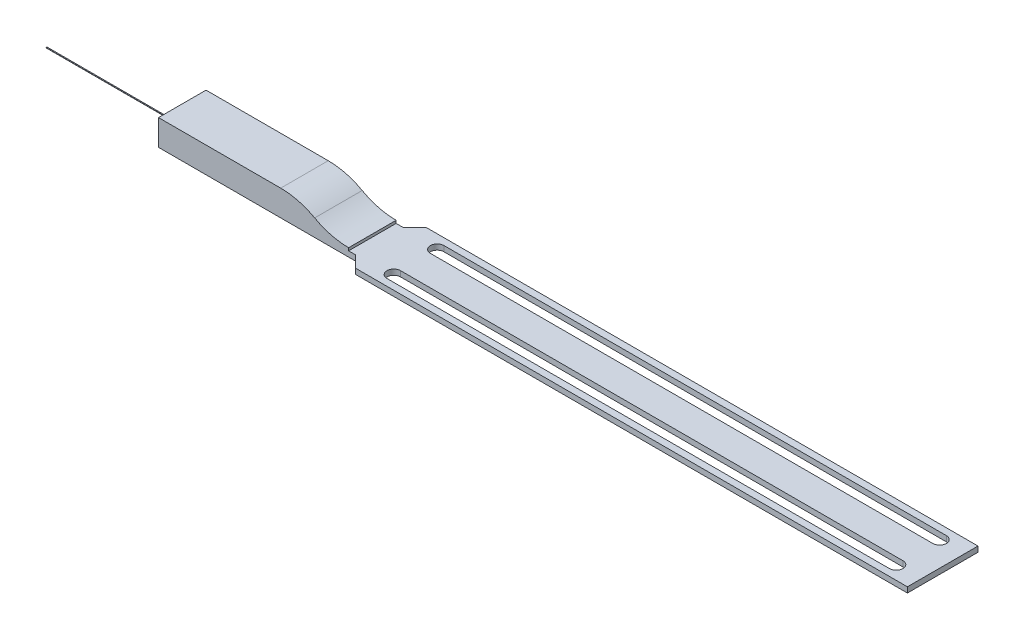
ISO-10303-21;
HEADER;
FILE_DESCRIPTION(('STEP AP214'),'2;1');
FILE_NAME('part.step','',(''),(''),'','','');
FILE_SCHEMA(('AUTOMOTIVE_DESIGN { 1 0 10303 214 1 1 1 1 }'));
ENDSEC;
DATA;
#1=APPLICATION_CONTEXT('core data for automotive mechanical design processes');
#2=APPLICATION_PROTOCOL_DEFINITION('international standard','automotive_design',2000,#1);
#3=PRODUCT_CONTEXT('',#1,'mechanical');
#4=PRODUCT('Part','Part','',(#3));
#5=PRODUCT_RELATED_PRODUCT_CATEGORY('part','',(#4));
#6=PRODUCT_DEFINITION_FORMATION('','',#4);
#7=PRODUCT_DEFINITION_CONTEXT('part definition',#1,'design');
#8=PRODUCT_DEFINITION('design','',#6,#7);
#9=PRODUCT_DEFINITION_SHAPE('','',#8);
#10=(LENGTH_UNIT() NAMED_UNIT(*) SI_UNIT(.MILLI.,.METRE.));
#11=(NAMED_UNIT(*) PLANE_ANGLE_UNIT() SI_UNIT($,.RADIAN.));
#12=(NAMED_UNIT(*) SI_UNIT($,.STERADIAN.) SOLID_ANGLE_UNIT());
#13=UNCERTAINTY_MEASURE_WITH_UNIT(LENGTH_MEASURE(1.E-05),#10,'distance_accuracy_value','');
#14=(GEOMETRIC_REPRESENTATION_CONTEXT(3) GLOBAL_UNCERTAINTY_ASSIGNED_CONTEXT((#13)) GLOBAL_UNIT_ASSIGNED_CONTEXT((#10,
#11,#12)) REPRESENTATION_CONTEXT('',''));
#15=CARTESIAN_POINT('',(0.,0.,0.));
#16=DIRECTION('',(0.,0.,1.));
#17=DIRECTION('',(1.,0.,0.));
#18=AXIS2_PLACEMENT_3D('',#15,#16,#17);
#19=CARTESIAN_POINT('',(-7.,1.9,1.75));
#20=DIRECTION('',(1.,0.,0.));
#21=DIRECTION('',(0.,0.,-1.));
#22=AXIS2_PLACEMENT_3D('',#19,#20,#21);
#23=PLANE('',#22);
#24=DIRECTION('',(0.,0.,1.));
#25=VECTOR('',#24,1.);
#26=CARTESIAN_POINT('',(-7.,0.,1.75));
#27=LINE('',#26,#25);
#28=CARTESIAN_POINT('',(-7.,0.,-1.75));
#29=VERTEX_POINT('',#28);
#30=CARTESIAN_POINT('',(-7.,0.,1.75));
#31=VERTEX_POINT('',#30);
#32=EDGE_CURVE('E366',#29,#31,#27,.T.);
#33=ORIENTED_EDGE('',*,*,#32,.T.);
#34=DIRECTION('',(0.,-1.,0.));
#35=VECTOR('',#34,1.);
#36=CARTESIAN_POINT('',(-7.,1.9,1.75));
#37=LINE('',#36,#35);
#38=CARTESIAN_POINT('',(-7.,1.9,1.75));
#39=VERTEX_POINT('',#38);
#40=EDGE_CURVE('E370',#39,#31,#37,.T.);
#41=ORIENTED_EDGE('',*,*,#40,.F.);
#42=DIRECTION('',(0.,0.,1.));
#43=VECTOR('',#42,1.);
#44=CARTESIAN_POINT('',(-7.,1.9,1.75));
#45=LINE('',#44,#43);
#46=CARTESIAN_POINT('',(-7.,1.9,-1.75));
#47=VERTEX_POINT('',#46);
#48=EDGE_CURVE('E358',#47,#39,#45,.T.);
#49=ORIENTED_EDGE('',*,*,#48,.F.);
#50=DIRECTION('',(0.,-1.,0.));
#51=VECTOR('',#50,1.);
#52=CARTESIAN_POINT('',(-7.,1.9,-1.75));
#53=LINE('',#52,#51);
#54=EDGE_CURVE('E373',#47,#29,#53,.T.);
#55=ORIENTED_EDGE('',*,*,#54,.T.);
#56=EDGE_LOOP('',(#33,#41,#49,#55));
#57=FACE_BOUND('',#56,.T.);
#58=DIRECTION('',(0.,1.,0.));
#59=VECTOR('',#58,1.);
#60=CARTESIAN_POINT('',(-7.,0.488,0.0349999999999996));
#61=LINE('',#60,#59);
#62=CARTESIAN_POINT('',(-7.,0.488,0.0349999999999996));
#63=VERTEX_POINT('',#62);
#64=CARTESIAN_POINT('',(-7.,0.512,0.0349999999999997));
#65=VERTEX_POINT('',#64);
#66=EDGE_CURVE('E217',#63,#65,#61,.T.);
#67=ORIENTED_EDGE('',*,*,#66,.F.);
#68=DIRECTION('',(0.,0.,1.));
#69=VECTOR('',#68,1.);
#70=CARTESIAN_POINT('',(-7.,0.488,-0.0350000000000004));
#71=LINE('',#70,#69);
#72=CARTESIAN_POINT('',(-7.,0.488,-0.0350000000000005));
#73=VERTEX_POINT('',#72);
#74=EDGE_CURVE('E214',#73,#63,#71,.T.);
#75=ORIENTED_EDGE('',*,*,#74,.F.);
#76=DIRECTION('',(0.,-1.,0.));
#77=VECTOR('',#76,1.);
#78=CARTESIAN_POINT('',(-7.,0.488,-0.0350000000000004));
#79=LINE('',#78,#77);
#80=CARTESIAN_POINT('',(-7.,0.512,-0.0350000000000004));
#81=VERTEX_POINT('',#80);
#82=EDGE_CURVE('E56',#81,#73,#79,.T.);
#83=ORIENTED_EDGE('',*,*,#82,.F.);
#84=DIRECTION('',(0.,0.,-1.));
#85=VECTOR('',#84,1.);
#86=CARTESIAN_POINT('',(-7.,0.512,-0.0350000000000004));
#87=LINE('',#86,#85);
#88=EDGE_CURVE('E51',#65,#81,#87,.T.);
#89=ORIENTED_EDGE('',*,*,#88,.F.);
#90=EDGE_LOOP('',(#67,#75,#83,#89));
#91=FACE_BOUND('',#90,.T.);
#92=ADVANCED_FACE('F36',(#57,#91),#23,.F.);
#93=CARTESIAN_POINT('',(7.,1.9,1.75));
#94=DIRECTION('',(-1.,0.,0.));
#95=DIRECTION('',(0.,0.,1.));
#96=AXIS2_PLACEMENT_3D('',#93,#94,#95);
#97=PLANE('',#96);
#98=DIRECTION('',(0.,-1.,0.));
#99=VECTOR('',#98,1.);
#100=CARTESIAN_POINT('',(7.,1.9,-1.75));
#101=LINE('',#100,#99);
#102=CARTESIAN_POINT('',(7.,0.6,-1.75));
#103=VERTEX_POINT('',#102);
#104=CARTESIAN_POINT('',(7.,0.4,-1.75));
#105=VERTEX_POINT('',#104);
#106=EDGE_CURVE('E376',#103,#105,#101,.T.);
#107=ORIENTED_EDGE('',*,*,#106,.F.);
#108=DIRECTION('',(0.,0.,1.));
#109=VECTOR('',#108,1.);
#110=CARTESIAN_POINT('',(7.,0.6,-2.6));
#111=LINE('',#110,#109);
#112=CARTESIAN_POINT('',(7.,0.6,1.75));
#113=VERTEX_POINT('',#112);
#114=EDGE_CURVE('E218',#103,#113,#111,.T.);
#115=ORIENTED_EDGE('',*,*,#114,.T.);
#116=DIRECTION('',(0.,-1.,0.));
#117=VECTOR('',#116,1.);
#118=CARTESIAN_POINT('',(7.,1.9,1.75));
#119=LINE('',#118,#117);
#120=CARTESIAN_POINT('',(7.,0.4,1.75));
#121=VERTEX_POINT('',#120);
#122=EDGE_CURVE('E364',#113,#121,#119,.T.);
#123=ORIENTED_EDGE('',*,*,#122,.T.);
#124=DIRECTION('',(0.,0.,-1.));
#125=VECTOR('',#124,1.);
#126=CARTESIAN_POINT('',(7.,0.4,1.75));
#127=LINE('',#126,#125);
#128=EDGE_CURVE('E303',#121,#105,#127,.T.);
#129=ORIENTED_EDGE('',*,*,#128,.T.);
#130=EDGE_LOOP('',(#107,#115,#123,#129));
#131=FACE_BOUND('',#130,.T.);
#132=ADVANCED_FACE('F38',(#131),#97,.F.);
#133=CARTESIAN_POINT('',(-7.,1.9,-1.75));
#134=DIRECTION('',(0.,0.,1.));
#135=DIRECTION('',(1.,0.,0.));
#136=AXIS2_PLACEMENT_3D('',#133,#134,#135);
#137=PLANE('',#136);
#138=CARTESIAN_POINT('',(2.,-3.23269230769231,-1.75));
#139=DIRECTION('',(0.,0.,1.));
#140=DIRECTION('',(1.,0.,0.));
#141=AXIS2_PLACEMENT_3D('',#138,#139,#140);
#142=CIRCLE('',#141,5.13269230769231);
#143=CARTESIAN_POINT('',(2.,1.9,-1.75));
#144=VERTEX_POINT('',#143);
#145=CARTESIAN_POINT('',(4.5,1.25,-1.75));
#146=VERTEX_POINT('',#145);
#147=EDGE_CURVE('E232',#144,#146,#142,.F.);
#148=ORIENTED_EDGE('',*,*,#147,.T.);
#149=CARTESIAN_POINT('',(7.,5.73269230769231,-1.75));
#150=DIRECTION('',(0.,0.,1.));
#151=DIRECTION('',(1.,0.,0.));
#152=AXIS2_PLACEMENT_3D('',#149,#150,#151);
#153=CIRCLE('',#152,5.13269230769231);
#154=EDGE_CURVE('E235',#146,#103,#153,.T.);
#155=ORIENTED_EDGE('',*,*,#154,.T.);
#156=ORIENTED_EDGE('',*,*,#106,.T.);
#157=DIRECTION('',(1.,0.,0.));
#158=VECTOR('',#157,1.);
#159=CARTESIAN_POINT('',(7.,0.4,-1.75));
#160=LINE('',#159,#158);
#161=CARTESIAN_POINT('',(7.5,0.4,-1.75));
#162=VERTEX_POINT('',#161);
#163=EDGE_CURVE('E306',#105,#162,#160,.T.);
#164=ORIENTED_EDGE('',*,*,#163,.T.);
#165=DIRECTION('',(0.,-1.,0.));
#166=VECTOR('',#165,1.);
#167=CARTESIAN_POINT('',(7.5,0.4,-1.75));
#168=LINE('',#167,#166);
#169=CARTESIAN_POINT('',(7.5,0.,-1.75));
#170=VERTEX_POINT('',#169);
#171=EDGE_CURVE('E328',#162,#170,#168,.T.);
#172=ORIENTED_EDGE('',*,*,#171,.T.);
#173=DIRECTION('',(-1.,0.,0.));
#174=VECTOR('',#173,1.);
#175=CARTESIAN_POINT('',(-7.,0.,-1.75));
#176=LINE('',#175,#174);
#177=EDGE_CURVE('E345',#170,#29,#176,.T.);
#178=ORIENTED_EDGE('',*,*,#177,.T.);
#179=ORIENTED_EDGE('',*,*,#54,.F.);
#180=DIRECTION('',(-1.,0.,0.));
#181=VECTOR('',#180,1.);
#182=CARTESIAN_POINT('',(-7.,1.9,-1.75));
#183=LINE('',#182,#181);
#184=EDGE_CURVE('E356',#144,#47,#183,.T.);
#185=ORIENTED_EDGE('',*,*,#184,.F.);
#186=EDGE_LOOP('',(#148,#155,#156,#164,#172,#178,#179,#185));
#187=FACE_BOUND('',#186,.T.);
#188=ADVANCED_FACE('F385',(#187),#137,.F.);
#189=CARTESIAN_POINT('',(-7.,1.9,1.75));
#190=DIRECTION('',(0.,0.,-1.));
#191=DIRECTION('',(-1.,0.,0.));
#192=AXIS2_PLACEMENT_3D('',#189,#190,#191);
#193=PLANE('',#192);
#194=ORIENTED_EDGE('',*,*,#122,.F.);
#195=CARTESIAN_POINT('',(7.,5.73269230769231,1.75));
#196=DIRECTION('',(0.,0.,-1.));
#197=DIRECTION('',(-1.,0.,0.));
#198=AXIS2_PLACEMENT_3D('',#195,#196,#197);
#199=CIRCLE('',#198,5.13269230769231);
#200=CARTESIAN_POINT('',(4.5,1.25,1.75));
#201=VERTEX_POINT('',#200);
#202=EDGE_CURVE('E11',#113,#201,#199,.T.);
#203=ORIENTED_EDGE('',*,*,#202,.T.);
#204=CARTESIAN_POINT('',(2.,-3.23269230769231,1.75));
#205=DIRECTION('',(0.,0.,-1.));
#206=DIRECTION('',(-1.,0.,0.));
#207=AXIS2_PLACEMENT_3D('',#204,#205,#206);
#208=CIRCLE('',#207,5.13269230769231);
#209=CARTESIAN_POINT('',(2.,1.9,1.75));
#210=VERTEX_POINT('',#209);
#211=EDGE_CURVE('E228',#201,#210,#208,.F.);
#212=ORIENTED_EDGE('',*,*,#211,.T.);
#213=DIRECTION('',(1.,0.,0.));
#214=VECTOR('',#213,1.);
#215=CARTESIAN_POINT('',(-7.,1.9,1.75));
#216=LINE('',#215,#214);
#217=EDGE_CURVE('E361',#39,#210,#216,.T.);
#218=ORIENTED_EDGE('',*,*,#217,.F.);
#219=ORIENTED_EDGE('',*,*,#40,.T.);
#220=DIRECTION('',(1.,0.,0.));
#221=VECTOR('',#220,1.);
#222=CARTESIAN_POINT('',(-7.,0.,1.75));
#223=LINE('',#222,#221);
#224=CARTESIAN_POINT('',(7.5,0.,1.75));
#225=VERTEX_POINT('',#224);
#226=EDGE_CURVE('E359',#31,#225,#223,.T.);
#227=ORIENTED_EDGE('',*,*,#226,.T.);
#228=DIRECTION('',(0.,-1.,0.));
#229=VECTOR('',#228,1.);
#230=CARTESIAN_POINT('',(7.5,0.4,1.75));
#231=LINE('',#230,#229);
#232=CARTESIAN_POINT('',(7.5,0.4,1.75));
#233=VERTEX_POINT('',#232);
#234=EDGE_CURVE('E342',#233,#225,#231,.T.);
#235=ORIENTED_EDGE('',*,*,#234,.F.);
#236=DIRECTION('',(-1.,0.,0.));
#237=VECTOR('',#236,1.);
#238=CARTESIAN_POINT('',(7.,0.4,1.75));
#239=LINE('',#238,#237);
#240=EDGE_CURVE('E325',#233,#121,#239,.T.);
#241=ORIENTED_EDGE('',*,*,#240,.T.);
#242=EDGE_LOOP('',(#194,#203,#212,#218,#219,#227,#235,#241));
#243=FACE_BOUND('',#242,.T.);
#244=ADVANCED_FACE('F393',(#243),#193,.F.);
#245=CARTESIAN_POINT('',(0.,1.9,0.));
#246=DIRECTION('',(0.,-1.,0.));
#247=DIRECTION('',(0.,0.,-1.));
#248=AXIS2_PLACEMENT_3D('',#245,#246,#247);
#249=PLANE('',#248);
#250=ORIENTED_EDGE('',*,*,#217,.T.);
#251=DIRECTION('',(0.,0.,1.));
#252=VECTOR('',#251,1.);
#253=CARTESIAN_POINT('',(2.,1.9,-2.6));
#254=LINE('',#253,#252);
#255=EDGE_CURVE('E44',#210,#144,#254,.F.);
#256=ORIENTED_EDGE('',*,*,#255,.T.);
#257=ORIENTED_EDGE('',*,*,#184,.T.);
#258=ORIENTED_EDGE('',*,*,#48,.T.);
#259=EDGE_LOOP('',(#250,#256,#257,#258));
#260=FACE_BOUND('',#259,.T.);
#261=ADVANCED_FACE('F380',(#260),#249,.F.);
#262=CARTESIAN_POINT('',(0.,0.,0.));
#263=DIRECTION('',(0.,-1.,0.));
#264=DIRECTION('',(0.,0.,-1.));
#265=AXIS2_PLACEMENT_3D('',#262,#263,#264);
#266=PLANE('',#265);
#267=ORIENTED_EDGE('',*,*,#177,.F.);
#268=DIRECTION('',(0.707106781186548,0.,-0.707106781186547));
#269=VECTOR('',#268,1.);
#270=CARTESIAN_POINT('',(7.5,0.,-1.75));
#271=LINE('',#270,#269);
#272=CARTESIAN_POINT('',(8.35,0.,-2.6));
#273=VERTEX_POINT('',#272);
#274=EDGE_CURVE('E296',#170,#273,#271,.T.);
#275=ORIENTED_EDGE('',*,*,#274,.T.);
#276=DIRECTION('',(1.,0.,0.));
#277=VECTOR('',#276,1.);
#278=CARTESIAN_POINT('',(8.35,0.,-2.6));
#279=LINE('',#278,#277);
#280=CARTESIAN_POINT('',(49.,0.,-2.6));
#281=VERTEX_POINT('',#280);
#282=EDGE_CURVE('E331',#273,#281,#279,.T.);
#283=ORIENTED_EDGE('',*,*,#282,.T.);
#284=DIRECTION('',(0.,0.,1.));
#285=VECTOR('',#284,1.);
#286=CARTESIAN_POINT('',(49.,0.,2.6));
#287=LINE('',#286,#285);
#288=CARTESIAN_POINT('',(49.,0.,2.6));
#289=VERTEX_POINT('',#288);
#290=EDGE_CURVE('E334',#281,#289,#287,.T.);
#291=ORIENTED_EDGE('',*,*,#290,.T.);
#292=DIRECTION('',(-1.,0.,0.));
#293=VECTOR('',#292,1.);
#294=CARTESIAN_POINT('',(8.35,0.,2.6));
#295=LINE('',#294,#293);
#296=CARTESIAN_POINT('',(8.35,0.,2.6));
#297=VERTEX_POINT('',#296);
#298=EDGE_CURVE('E337',#289,#297,#295,.T.);
#299=ORIENTED_EDGE('',*,*,#298,.T.);
#300=DIRECTION('',(-0.707106781186548,0.,-0.707106781186547));
#301=VECTOR('',#300,1.);
#302=CARTESIAN_POINT('',(7.5,0.,1.75));
#303=LINE('',#302,#301);
#304=EDGE_CURVE('E307',#297,#225,#303,.T.);
#305=ORIENTED_EDGE('',*,*,#304,.T.);
#306=ORIENTED_EDGE('',*,*,#226,.F.);
#307=ORIENTED_EDGE('',*,*,#32,.F.);
#308=EDGE_LOOP('',(#267,#275,#283,#291,#299,#305,#306,#307));
#309=FACE_BOUND('',#308,.T.);
#310=CARTESIAN_POINT('',(47.175,0.,-1.6));
#311=DIRECTION('',(0.,-1.,0.));
#312=DIRECTION('',(0.,0.,-1.));
#313=AXIS2_PLACEMENT_3D('',#310,#311,#312);
#314=CIRCLE('',#313,0.500000000000001);
#315=CARTESIAN_POINT('',(47.175,0.,-2.1));
#316=VERTEX_POINT('',#315);
#317=CARTESIAN_POINT('',(47.175,0.,-1.1));
#318=VERTEX_POINT('',#317);
#319=EDGE_CURVE('E238',#316,#318,#314,.T.);
#320=ORIENTED_EDGE('',*,*,#319,.F.);
#321=DIRECTION('',(1.,0.,0.));
#322=VECTOR('',#321,1.);
#323=CARTESIAN_POINT('',(47.175,0.,-2.1));
#324=LINE('',#323,#322);
#325=CARTESIAN_POINT('',(10.175,0.,-2.1));
#326=VERTEX_POINT('',#325);
#327=EDGE_CURVE('E243',#326,#316,#324,.T.);
#328=ORIENTED_EDGE('',*,*,#327,.F.);
#329=CARTESIAN_POINT('',(10.175,0.,-1.6));
#330=DIRECTION('',(0.,-1.,0.));
#331=DIRECTION('',(0.,0.,-1.));
#332=AXIS2_PLACEMENT_3D('',#329,#330,#331);
#333=CIRCLE('',#332,0.500000000000001);
#334=CARTESIAN_POINT('',(10.175,0.,-1.1));
#335=VERTEX_POINT('',#334);
#336=EDGE_CURVE('E257',#335,#326,#333,.T.);
#337=ORIENTED_EDGE('',*,*,#336,.F.);
#338=DIRECTION('',(-1.,0.,0.));
#339=VECTOR('',#338,1.);
#340=CARTESIAN_POINT('',(47.175,0.,-1.1));
#341=LINE('',#340,#339);
#342=EDGE_CURVE('E254',#318,#335,#341,.T.);
#343=ORIENTED_EDGE('',*,*,#342,.F.);
#344=EDGE_LOOP('',(#320,#328,#337,#343));
#345=FACE_BOUND('',#344,.T.);
#346=CARTESIAN_POINT('',(47.175,0.,1.6));
#347=DIRECTION('',(0.,-1.,0.));
#348=DIRECTION('',(0.,0.,-1.));
#349=AXIS2_PLACEMENT_3D('',#346,#347,#348);
#350=CIRCLE('',#349,0.5);
#351=CARTESIAN_POINT('',(47.175,0.,1.1));
#352=VERTEX_POINT('',#351);
#353=CARTESIAN_POINT('',(47.175,0.,2.1));
#354=VERTEX_POINT('',#353);
#355=EDGE_CURVE('E264',#352,#354,#350,.T.);
#356=ORIENTED_EDGE('',*,*,#355,.F.);
#357=DIRECTION('',(1.,0.,0.));
#358=VECTOR('',#357,1.);
#359=CARTESIAN_POINT('',(47.175,0.,1.1));
#360=LINE('',#359,#358);
#361=CARTESIAN_POINT('',(10.175,0.,1.09999999999999));
#362=VERTEX_POINT('',#361);
#363=EDGE_CURVE('E275',#362,#352,#360,.T.);
#364=ORIENTED_EDGE('',*,*,#363,.F.);
#365=CARTESIAN_POINT('',(10.175,0.,1.59999999999999));
#366=DIRECTION('',(0.,-1.,0.));
#367=DIRECTION('',(0.,0.,-1.));
#368=AXIS2_PLACEMENT_3D('',#365,#366,#367);
#369=CIRCLE('',#368,0.5);
#370=CARTESIAN_POINT('',(10.175,0.,2.09999999999999));
#371=VERTEX_POINT('',#370);
#372=EDGE_CURVE('E289',#371,#362,#369,.T.);
#373=ORIENTED_EDGE('',*,*,#372,.F.);
#374=DIRECTION('',(-1.,0.,0.));
#375=VECTOR('',#374,1.);
#376=CARTESIAN_POINT('',(47.175,0.,2.1));
#377=LINE('',#376,#375);
#378=EDGE_CURVE('E286',#354,#371,#377,.T.);
#379=ORIENTED_EDGE('',*,*,#378,.F.);
#380=EDGE_LOOP('',(#356,#364,#373,#379));
#381=FACE_BOUND('',#380,.T.);
#382=ADVANCED_FACE('F426',(#309,#345,#381),#266,.T.);
#383=CARTESIAN_POINT('',(7.5,0.4,1.75));
#384=DIRECTION('',(-0.707106781186547,0.,0.707106781186548));
#385=DIRECTION('',(0.707106781186548,0.,0.707106781186547));
#386=AXIS2_PLACEMENT_3D('',#383,#384,#385);
#387=PLANE('',#386);
#388=ORIENTED_EDGE('',*,*,#304,.F.);
#389=DIRECTION('',(0.,-1.,0.));
#390=VECTOR('',#389,1.);
#391=CARTESIAN_POINT('',(8.35,0.4,2.6));
#392=LINE('',#391,#390);
#393=CARTESIAN_POINT('',(8.35,0.4,2.6));
#394=VERTEX_POINT('',#393);
#395=EDGE_CURVE('E346',#394,#297,#392,.T.);
#396=ORIENTED_EDGE('',*,*,#395,.F.);
#397=DIRECTION('',(-0.707106781186548,0.,-0.707106781186547));
#398=VECTOR('',#397,1.);
#399=CARTESIAN_POINT('',(7.5,0.4,1.75));
#400=LINE('',#399,#398);
#401=EDGE_CURVE('E322',#394,#233,#400,.T.);
#402=ORIENTED_EDGE('',*,*,#401,.T.);
#403=ORIENTED_EDGE('',*,*,#234,.T.);
#404=EDGE_LOOP('',(#388,#396,#402,#403));
#405=FACE_BOUND('',#404,.T.);
#406=ADVANCED_FACE('F409',(#405),#387,.T.);
#407=CARTESIAN_POINT('',(8.35,0.4,2.6));
#408=DIRECTION('',(0.,0.,1.));
#409=DIRECTION('',(1.,0.,0.));
#410=AXIS2_PLACEMENT_3D('',#407,#408,#409);
#411=PLANE('',#410);
#412=ORIENTED_EDGE('',*,*,#298,.F.);
#413=DIRECTION('',(0.,-1.,0.));
#414=VECTOR('',#413,1.);
#415=CARTESIAN_POINT('',(49.,0.4,2.6));
#416=LINE('',#415,#414);
#417=CARTESIAN_POINT('',(49.,0.4,2.6));
#418=VERTEX_POINT('',#417);
#419=EDGE_CURVE('E348',#418,#289,#416,.T.);
#420=ORIENTED_EDGE('',*,*,#419,.F.);
#421=DIRECTION('',(-1.,0.,0.));
#422=VECTOR('',#421,1.);
#423=CARTESIAN_POINT('',(8.35,0.4,2.6));
#424=LINE('',#423,#422);
#425=EDGE_CURVE('E319',#418,#394,#424,.T.);
#426=ORIENTED_EDGE('',*,*,#425,.T.);
#427=ORIENTED_EDGE('',*,*,#395,.T.);
#428=EDGE_LOOP('',(#412,#420,#426,#427));
#429=FACE_BOUND('',#428,.T.);
#430=ADVANCED_FACE('F414',(#429),#411,.T.);
#431=CARTESIAN_POINT('',(49.,0.4,2.6));
#432=DIRECTION('',(1.,0.,0.));
#433=DIRECTION('',(0.,0.,-1.));
#434=AXIS2_PLACEMENT_3D('',#431,#432,#433);
#435=PLANE('',#434);
#436=ORIENTED_EDGE('',*,*,#290,.F.);
#437=DIRECTION('',(0.,-1.,0.));
#438=VECTOR('',#437,1.);
#439=CARTESIAN_POINT('',(49.,0.4,-2.6));
#440=LINE('',#439,#438);
#441=CARTESIAN_POINT('',(49.,0.4,-2.6));
#442=VERTEX_POINT('',#441);
#443=EDGE_CURVE('E350',#442,#281,#440,.T.);
#444=ORIENTED_EDGE('',*,*,#443,.F.);
#445=DIRECTION('',(0.,0.,1.));
#446=VECTOR('',#445,1.);
#447=CARTESIAN_POINT('',(49.,0.4,2.6));
#448=LINE('',#447,#446);
#449=EDGE_CURVE('E316',#442,#418,#448,.T.);
#450=ORIENTED_EDGE('',*,*,#449,.T.);
#451=ORIENTED_EDGE('',*,*,#419,.T.);
#452=EDGE_LOOP('',(#436,#444,#450,#451));
#453=FACE_BOUND('',#452,.T.);
#454=ADVANCED_FACE('F417',(#453),#435,.T.);
#455=CARTESIAN_POINT('',(8.35,0.4,-2.6));
#456=DIRECTION('',(0.,0.,-1.));
#457=DIRECTION('',(-1.,0.,0.));
#458=AXIS2_PLACEMENT_3D('',#455,#456,#457);
#459=PLANE('',#458);
#460=ORIENTED_EDGE('',*,*,#282,.F.);
#461=DIRECTION('',(0.,-1.,0.));
#462=VECTOR('',#461,1.);
#463=CARTESIAN_POINT('',(8.35,0.4,-2.6));
#464=LINE('',#463,#462);
#465=CARTESIAN_POINT('',(8.35,0.4,-2.6));
#466=VERTEX_POINT('',#465);
#467=EDGE_CURVE('E352',#466,#273,#464,.T.);
#468=ORIENTED_EDGE('',*,*,#467,.F.);
#469=DIRECTION('',(1.,0.,0.));
#470=VECTOR('',#469,1.);
#471=CARTESIAN_POINT('',(8.35,0.4,-2.6));
#472=LINE('',#471,#470);
#473=EDGE_CURVE('E313',#466,#442,#472,.T.);
#474=ORIENTED_EDGE('',*,*,#473,.T.);
#475=ORIENTED_EDGE('',*,*,#443,.T.);
#476=EDGE_LOOP('',(#460,#468,#474,#475));
#477=FACE_BOUND('',#476,.T.);
#478=ADVANCED_FACE('F421',(#477),#459,.T.);
#479=CARTESIAN_POINT('',(7.5,0.4,-1.75));
#480=DIRECTION('',(-0.707106781186547,0.,-0.707106781186548));
#481=DIRECTION('',(-0.707106781186548,0.,0.707106781186547));
#482=AXIS2_PLACEMENT_3D('',#479,#480,#481);
#483=PLANE('',#482);
#484=ORIENTED_EDGE('',*,*,#274,.F.);
#485=ORIENTED_EDGE('',*,*,#171,.F.);
#486=DIRECTION('',(0.707106781186548,0.,-0.707106781186547));
#487=VECTOR('',#486,1.);
#488=CARTESIAN_POINT('',(7.5,0.4,-1.75));
#489=LINE('',#488,#487);
#490=EDGE_CURVE('E310',#162,#466,#489,.T.);
#491=ORIENTED_EDGE('',*,*,#490,.T.);
#492=ORIENTED_EDGE('',*,*,#467,.T.);
#493=EDGE_LOOP('',(#484,#485,#491,#492));
#494=FACE_BOUND('',#493,.T.);
#495=ADVANCED_FACE('F424',(#494),#483,.T.);
#496=CARTESIAN_POINT('',(0.,0.4,0.));
#497=DIRECTION('',(0.,-1.,0.));
#498=DIRECTION('',(0.,0.,-1.));
#499=AXIS2_PLACEMENT_3D('',#496,#497,#498);
#500=PLANE('',#499);
#501=DIRECTION('',(1.,0.,0.));
#502=VECTOR('',#501,1.);
#503=CARTESIAN_POINT('',(47.175,0.4,-2.1));
#504=LINE('',#503,#502);
#505=CARTESIAN_POINT('',(10.175,0.4,-2.1));
#506=VERTEX_POINT('',#505);
#507=CARTESIAN_POINT('',(47.175,0.4,-2.1));
#508=VERTEX_POINT('',#507);
#509=EDGE_CURVE('E249',#506,#508,#504,.T.);
#510=ORIENTED_EDGE('',*,*,#509,.T.);
#511=CARTESIAN_POINT('',(47.175,0.4,-1.6));
#512=DIRECTION('',(0.,-1.,0.));
#513=DIRECTION('',(0.,0.,-1.));
#514=AXIS2_PLACEMENT_3D('',#511,#512,#513);
#515=CIRCLE('',#514,0.500000000000001);
#516=CARTESIAN_POINT('',(47.175,0.4,-1.1));
#517=VERTEX_POINT('',#516);
#518=EDGE_CURVE('E239',#508,#517,#515,.T.);
#519=ORIENTED_EDGE('',*,*,#518,.T.);
#520=DIRECTION('',(-1.,0.,0.));
#521=VECTOR('',#520,1.);
#522=CARTESIAN_POINT('',(47.175,0.4,-1.1));
#523=LINE('',#522,#521);
#524=CARTESIAN_POINT('',(10.175,0.4,-1.1));
#525=VERTEX_POINT('',#524);
#526=EDGE_CURVE('E242',#517,#525,#523,.T.);
#527=ORIENTED_EDGE('',*,*,#526,.T.);
#528=CARTESIAN_POINT('',(10.175,0.4,-1.6));
#529=DIRECTION('',(0.,-1.,0.));
#530=DIRECTION('',(0.,0.,-1.));
#531=AXIS2_PLACEMENT_3D('',#528,#529,#530);
#532=CIRCLE('',#531,0.500000000000001);
#533=EDGE_CURVE('E246',#525,#506,#532,.T.);
#534=ORIENTED_EDGE('',*,*,#533,.T.);
#535=EDGE_LOOP('',(#510,#519,#527,#534));
#536=FACE_BOUND('',#535,.T.);
#537=DIRECTION('',(1.,0.,0.));
#538=VECTOR('',#537,1.);
#539=CARTESIAN_POINT('',(47.175,0.4,1.1));
#540=LINE('',#539,#538);
#541=CARTESIAN_POINT('',(10.175,0.4,1.09999999999999));
#542=VERTEX_POINT('',#541);
#543=CARTESIAN_POINT('',(47.175,0.4,1.1));
#544=VERTEX_POINT('',#543);
#545=EDGE_CURVE('E281',#542,#544,#540,.T.);
#546=ORIENTED_EDGE('',*,*,#545,.T.);
#547=CARTESIAN_POINT('',(47.175,0.4,1.6));
#548=DIRECTION('',(0.,-1.,0.));
#549=DIRECTION('',(0.,0.,-1.));
#550=AXIS2_PLACEMENT_3D('',#547,#548,#549);
#551=CIRCLE('',#550,0.5);
#552=CARTESIAN_POINT('',(47.175,0.4,2.1));
#553=VERTEX_POINT('',#552);
#554=EDGE_CURVE('E271',#544,#553,#551,.T.);
#555=ORIENTED_EDGE('',*,*,#554,.T.);
#556=DIRECTION('',(-1.,0.,0.));
#557=VECTOR('',#556,1.);
#558=CARTESIAN_POINT('',(47.175,0.4,2.1));
#559=LINE('',#558,#557);
#560=CARTESIAN_POINT('',(10.175,0.4,2.09999999999999));
#561=VERTEX_POINT('',#560);
#562=EDGE_CURVE('E274',#553,#561,#559,.T.);
#563=ORIENTED_EDGE('',*,*,#562,.T.);
#564=CARTESIAN_POINT('',(10.175,0.4,1.59999999999999));
#565=DIRECTION('',(0.,-1.,0.));
#566=DIRECTION('',(0.,0.,-1.));
#567=AXIS2_PLACEMENT_3D('',#564,#565,#566);
#568=CIRCLE('',#567,0.5);
#569=EDGE_CURVE('E278',#561,#542,#568,.T.);
#570=ORIENTED_EDGE('',*,*,#569,.T.);
#571=EDGE_LOOP('',(#546,#555,#563,#570));
#572=FACE_BOUND('',#571,.T.);
#573=ORIENTED_EDGE('',*,*,#128,.F.);
#574=ORIENTED_EDGE('',*,*,#240,.F.);
#575=ORIENTED_EDGE('',*,*,#401,.F.);
#576=ORIENTED_EDGE('',*,*,#425,.F.);
#577=ORIENTED_EDGE('',*,*,#449,.F.);
#578=ORIENTED_EDGE('',*,*,#473,.F.);
#579=ORIENTED_EDGE('',*,*,#490,.F.);
#580=ORIENTED_EDGE('',*,*,#163,.F.);
#581=EDGE_LOOP('',(#573,#574,#575,#576,#577,#578,#579,#580));
#582=FACE_BOUND('',#581,.T.);
#583=ADVANCED_FACE('F404',(#536,#572,#582),#500,.F.);
#584=CARTESIAN_POINT('',(47.175,0.4,1.6));
#585=DIRECTION('',(0.,-1.,0.));
#586=DIRECTION('',(0.,0.,-1.));
#587=AXIS2_PLACEMENT_3D('',#584,#585,#586);
#588=CYLINDRICAL_SURFACE('',#587,0.5);
#589=ORIENTED_EDGE('',*,*,#355,.T.);
#590=DIRECTION('',(0.,-1.,0.));
#591=VECTOR('',#590,1.);
#592=CARTESIAN_POINT('',(47.175,0.4,2.1));
#593=LINE('',#592,#591);
#594=EDGE_CURVE('E284',#553,#354,#593,.T.);
#595=ORIENTED_EDGE('',*,*,#594,.F.);
#596=ORIENTED_EDGE('',*,*,#554,.F.);
#597=DIRECTION('',(0.,-1.,0.));
#598=VECTOR('',#597,1.);
#599=CARTESIAN_POINT('',(47.175,0.4,1.1));
#600=LINE('',#599,#598);
#601=EDGE_CURVE('E294',#544,#352,#600,.T.);
#602=ORIENTED_EDGE('',*,*,#601,.T.);
#603=EDGE_LOOP('',(#589,#595,#596,#602));
#604=FACE_BOUND('',#603,.T.);
#605=ADVANCED_FACE('F439',(#604),#588,.F.);
#606=CARTESIAN_POINT('',(47.175,0.4,1.1));
#607=DIRECTION('',(0.,0.,-1.));
#608=DIRECTION('',(-1.,0.,0.));
#609=AXIS2_PLACEMENT_3D('',#606,#607,#608);
#610=PLANE('',#609);
#611=ORIENTED_EDGE('',*,*,#363,.T.);
#612=ORIENTED_EDGE('',*,*,#601,.F.);
#613=ORIENTED_EDGE('',*,*,#545,.F.);
#614=DIRECTION('',(0.,-1.,0.));
#615=VECTOR('',#614,1.);
#616=CARTESIAN_POINT('',(10.175,0.4,1.09999999999999));
#617=LINE('',#616,#615);
#618=EDGE_CURVE('E297',#542,#362,#617,.T.);
#619=ORIENTED_EDGE('',*,*,#618,.T.);
#620=EDGE_LOOP('',(#611,#612,#613,#619));
#621=FACE_BOUND('',#620,.T.);
#622=ADVANCED_FACE('F448',(#621),#610,.F.);
#623=CARTESIAN_POINT('',(10.175,0.4,1.59999999999999));
#624=DIRECTION('',(0.,-1.,0.));
#625=DIRECTION('',(0.,0.,-1.));
#626=AXIS2_PLACEMENT_3D('',#623,#624,#625);
#627=CYLINDRICAL_SURFACE('',#626,0.5);
#628=ORIENTED_EDGE('',*,*,#372,.T.);
#629=ORIENTED_EDGE('',*,*,#618,.F.);
#630=ORIENTED_EDGE('',*,*,#569,.F.);
#631=DIRECTION('',(0.,-1.,0.));
#632=VECTOR('',#631,1.);
#633=CARTESIAN_POINT('',(10.175,0.4,2.09999999999999));
#634=LINE('',#633,#632);
#635=EDGE_CURVE('E299',#561,#371,#634,.T.);
#636=ORIENTED_EDGE('',*,*,#635,.T.);
#637=EDGE_LOOP('',(#628,#629,#630,#636));
#638=FACE_BOUND('',#637,.T.);
#639=ADVANCED_FACE('F450',(#638),#627,.F.);
#640=CARTESIAN_POINT('',(47.175,0.4,2.1));
#641=DIRECTION('',(0.,0.,1.));
#642=DIRECTION('',(1.,0.,0.));
#643=AXIS2_PLACEMENT_3D('',#640,#641,#642);
#644=PLANE('',#643);
#645=ORIENTED_EDGE('',*,*,#378,.T.);
#646=ORIENTED_EDGE('',*,*,#635,.F.);
#647=ORIENTED_EDGE('',*,*,#562,.F.);
#648=ORIENTED_EDGE('',*,*,#594,.T.);
#649=EDGE_LOOP('',(#645,#646,#647,#648));
#650=FACE_BOUND('',#649,.T.);
#651=ADVANCED_FACE('F443',(#650),#644,.F.);
#652=CARTESIAN_POINT('',(47.175,0.4,-1.6));
#653=DIRECTION('',(0.,-1.,0.));
#654=DIRECTION('',(0.,0.,-1.));
#655=AXIS2_PLACEMENT_3D('',#652,#653,#654);
#656=CYLINDRICAL_SURFACE('',#655,0.500000000000001);
#657=ORIENTED_EDGE('',*,*,#319,.T.);
#658=DIRECTION('',(0.,-1.,0.));
#659=VECTOR('',#658,1.);
#660=CARTESIAN_POINT('',(47.175,0.4,-1.1));
#661=LINE('',#660,#659);
#662=EDGE_CURVE('E252',#517,#318,#661,.T.);
#663=ORIENTED_EDGE('',*,*,#662,.F.);
#664=ORIENTED_EDGE('',*,*,#518,.F.);
#665=DIRECTION('',(0.,-1.,0.));
#666=VECTOR('',#665,1.);
#667=CARTESIAN_POINT('',(47.175,0.4,-2.1));
#668=LINE('',#667,#666);
#669=EDGE_CURVE('E262',#508,#316,#668,.T.);
#670=ORIENTED_EDGE('',*,*,#669,.T.);
#671=EDGE_LOOP('',(#657,#663,#664,#670));
#672=FACE_BOUND('',#671,.T.);
#673=ADVANCED_FACE('F457',(#672),#656,.F.);
#674=CARTESIAN_POINT('',(47.175,0.4,-2.1));
#675=DIRECTION('',(0.,0.,-1.));
#676=DIRECTION('',(-1.,0.,0.));
#677=AXIS2_PLACEMENT_3D('',#674,#675,#676);
#678=PLANE('',#677);
#679=ORIENTED_EDGE('',*,*,#327,.T.);
#680=ORIENTED_EDGE('',*,*,#669,.F.);
#681=ORIENTED_EDGE('',*,*,#509,.F.);
#682=DIRECTION('',(0.,-1.,0.));
#683=VECTOR('',#682,1.);
#684=CARTESIAN_POINT('',(10.175,0.4,-2.1));
#685=LINE('',#684,#683);
#686=EDGE_CURVE('E265',#506,#326,#685,.T.);
#687=ORIENTED_EDGE('',*,*,#686,.T.);
#688=EDGE_LOOP('',(#679,#680,#681,#687));
#689=FACE_BOUND('',#688,.T.);
#690=ADVANCED_FACE('F521',(#689),#678,.F.);
#691=CARTESIAN_POINT('',(10.175,0.4,-1.6));
#692=DIRECTION('',(0.,-1.,0.));
#693=DIRECTION('',(0.,0.,-1.));
#694=AXIS2_PLACEMENT_3D('',#691,#692,#693);
#695=CYLINDRICAL_SURFACE('',#694,0.500000000000001);
#696=ORIENTED_EDGE('',*,*,#336,.T.);
#697=ORIENTED_EDGE('',*,*,#686,.F.);
#698=ORIENTED_EDGE('',*,*,#533,.F.);
#699=DIRECTION('',(0.,-1.,0.));
#700=VECTOR('',#699,1.);
#701=CARTESIAN_POINT('',(10.175,0.4,-1.1));
#702=LINE('',#701,#700);
#703=EDGE_CURVE('E267',#525,#335,#702,.T.);
#704=ORIENTED_EDGE('',*,*,#703,.T.);
#705=EDGE_LOOP('',(#696,#697,#698,#704));
#706=FACE_BOUND('',#705,.T.);
#707=ADVANCED_FACE('F532',(#706),#695,.F.);
#708=CARTESIAN_POINT('',(47.175,0.4,-1.1));
#709=DIRECTION('',(0.,0.,1.));
#710=DIRECTION('',(1.,0.,0.));
#711=AXIS2_PLACEMENT_3D('',#708,#709,#710);
#712=PLANE('',#711);
#713=ORIENTED_EDGE('',*,*,#342,.T.);
#714=ORIENTED_EDGE('',*,*,#703,.F.);
#715=ORIENTED_EDGE('',*,*,#526,.F.);
#716=ORIENTED_EDGE('',*,*,#662,.T.);
#717=EDGE_LOOP('',(#713,#714,#715,#716));
#718=FACE_BOUND('',#717,.T.);
#719=ADVANCED_FACE('F543',(#718),#712,.F.);
#720=CARTESIAN_POINT('',(7.,5.73269230769231,-2.6));
#721=DIRECTION('',(0.,0.,1.));
#722=DIRECTION('',(1.,0.,0.));
#723=AXIS2_PLACEMENT_3D('',#720,#721,#722);
#724=CYLINDRICAL_SURFACE('',#723,5.13269230769231);
#725=DIRECTION('',(0.,0.,1.));
#726=VECTOR('',#725,1.);
#727=CARTESIAN_POINT('',(4.5,1.25,-2.6));
#728=LINE('',#727,#726);
#729=EDGE_CURVE('E221',#146,#201,#728,.T.);
#730=ORIENTED_EDGE('',*,*,#729,.T.);
#731=ORIENTED_EDGE('',*,*,#202,.F.);
#732=ORIENTED_EDGE('',*,*,#114,.F.);
#733=ORIENTED_EDGE('',*,*,#154,.F.);
#734=EDGE_LOOP('',(#730,#731,#732,#733));
#735=FACE_BOUND('',#734,.T.);
#736=ADVANCED_FACE('F397',(#735),#724,.F.);
#737=CARTESIAN_POINT('',(2.,-3.23269230769231,-2.6));
#738=DIRECTION('',(0.,0.,1.));
#739=DIRECTION('',(1.,0.,0.));
#740=AXIS2_PLACEMENT_3D('',#737,#738,#739);
#741=CYLINDRICAL_SURFACE('',#740,5.13269230769231);
#742=ORIENTED_EDGE('',*,*,#255,.F.);
#743=ORIENTED_EDGE('',*,*,#211,.F.);
#744=ORIENTED_EDGE('',*,*,#729,.F.);
#745=ORIENTED_EDGE('',*,*,#147,.F.);
#746=EDGE_LOOP('',(#742,#743,#744,#745));
#747=FACE_BOUND('',#746,.T.);
#748=ADVANCED_FACE('F395',(#747),#741,.T.);
#749=CARTESIAN_POINT('',(-17.,0.488,0.0349999999999996));
#750=DIRECTION('',(0.,0.,-1.));
#751=DIRECTION('',(0.,1.,0.));
#752=AXIS2_PLACEMENT_3D('',#749,#750,#751);
#753=PLANE('',#752);
#754=ORIENTED_EDGE('',*,*,#66,.T.);
#755=DIRECTION('',(1.,0.,0.));
#756=VECTOR('',#755,1.);
#757=CARTESIAN_POINT('',(-17.,0.512,0.0349999999999996));
#758=LINE('',#757,#756);
#759=CARTESIAN_POINT('',(-17.,0.512,0.0349999999999996));
#760=VERTEX_POINT('',#759);
#761=EDGE_CURVE('E198',#760,#65,#758,.T.);
#762=ORIENTED_EDGE('',*,*,#761,.F.);
#763=DIRECTION('',(0.,1.,0.));
#764=VECTOR('',#763,1.);
#765=CARTESIAN_POINT('',(-17.,0.488,0.0349999999999996));
#766=LINE('',#765,#764);
#767=CARTESIAN_POINT('',(-17.,0.488,0.0349999999999996));
#768=VERTEX_POINT('',#767);
#769=EDGE_CURVE('E205',#768,#760,#766,.T.);
#770=ORIENTED_EDGE('',*,*,#769,.F.);
#771=DIRECTION('',(1.,0.,0.));
#772=VECTOR('',#771,1.);
#773=CARTESIAN_POINT('',(-17.,0.488,0.0349999999999996));
#774=LINE('',#773,#772);
#775=EDGE_CURVE('E661',#768,#63,#774,.T.);
#776=ORIENTED_EDGE('',*,*,#775,.T.);
#777=EDGE_LOOP('',(#754,#762,#770,#776));
#778=FACE_BOUND('',#777,.T.);
#779=ADVANCED_FACE('F216',(#778),#753,.F.);
#780=CARTESIAN_POINT('',(-17.,0.512,-0.0350000000000004));
#781=DIRECTION('',(0.,-1.,0.));
#782=DIRECTION('',(0.,0.,-1.));
#783=AXIS2_PLACEMENT_3D('',#780,#781,#782);
#784=PLANE('',#783);
#785=ORIENTED_EDGE('',*,*,#88,.T.);
#786=DIRECTION('',(1.,0.,0.));
#787=VECTOR('',#786,1.);
#788=CARTESIAN_POINT('',(-17.,0.512,-0.0350000000000004));
#789=LINE('',#788,#787);
#790=CARTESIAN_POINT('',(-17.,0.512,-0.0350000000000004));
#791=VERTEX_POINT('',#790);
#792=EDGE_CURVE('E201',#791,#81,#789,.T.);
#793=ORIENTED_EDGE('',*,*,#792,.F.);
#794=DIRECTION('',(0.,0.,-1.));
#795=VECTOR('',#794,1.);
#796=CARTESIAN_POINT('',(-17.,0.512,-0.0350000000000004));
#797=LINE('',#796,#795);
#798=EDGE_CURVE('E194',#760,#791,#797,.T.);
#799=ORIENTED_EDGE('',*,*,#798,.F.);
#800=ORIENTED_EDGE('',*,*,#761,.T.);
#801=EDGE_LOOP('',(#785,#793,#799,#800));
#802=FACE_BOUND('',#801,.T.);
#803=ADVANCED_FACE('F196',(#802),#784,.F.);
#804=CARTESIAN_POINT('',(-17.,0.488,-0.0350000000000004));
#805=DIRECTION('',(0.,0.,1.));
#806=DIRECTION('',(0.,-1.,0.));
#807=AXIS2_PLACEMENT_3D('',#804,#805,#806);
#808=PLANE('',#807);
#809=ORIENTED_EDGE('',*,*,#82,.T.);
#810=DIRECTION('',(1.,0.,0.));
#811=VECTOR('',#810,1.);
#812=CARTESIAN_POINT('',(-17.,0.488,-0.0350000000000004));
#813=LINE('',#812,#811);
#814=CARTESIAN_POINT('',(-17.,0.488,-0.0350000000000004));
#815=VERTEX_POINT('',#814);
#816=EDGE_CURVE('E223',#815,#73,#813,.T.);
#817=ORIENTED_EDGE('',*,*,#816,.F.);
#818=DIRECTION('',(0.,-1.,0.));
#819=VECTOR('',#818,1.);
#820=CARTESIAN_POINT('',(-17.,0.488,-0.0350000000000004));
#821=LINE('',#820,#819);
#822=EDGE_CURVE('E204',#791,#815,#821,.T.);
#823=ORIENTED_EDGE('',*,*,#822,.F.);
#824=ORIENTED_EDGE('',*,*,#792,.T.);
#825=EDGE_LOOP('',(#809,#817,#823,#824));
#826=FACE_BOUND('',#825,.T.);
#827=ADVANCED_FACE('F619',(#826),#808,.F.);
#828=CARTESIAN_POINT('',(-17.,0.488,-0.0350000000000004));
#829=DIRECTION('',(0.,1.,0.));
#830=DIRECTION('',(0.,0.,1.));
#831=AXIS2_PLACEMENT_3D('',#828,#829,#830);
#832=PLANE('',#831);
#833=ORIENTED_EDGE('',*,*,#74,.T.);
#834=ORIENTED_EDGE('',*,*,#775,.F.);
#835=DIRECTION('',(0.,0.,1.));
#836=VECTOR('',#835,1.);
#837=CARTESIAN_POINT('',(-17.,0.488,-0.0350000000000004));
#838=LINE('',#837,#836);
#839=EDGE_CURVE('E210',#815,#768,#838,.T.);
#840=ORIENTED_EDGE('',*,*,#839,.F.);
#841=ORIENTED_EDGE('',*,*,#816,.T.);
#842=EDGE_LOOP('',(#833,#834,#840,#841));
#843=FACE_BOUND('',#842,.T.);
#844=ADVANCED_FACE('F629',(#843),#832,.F.);
#845=CARTESIAN_POINT('',(-17.,0.,0.));
#846=DIRECTION('',(1.,0.,0.));
#847=DIRECTION('',(0.,0.,-1.));
#848=AXIS2_PLACEMENT_3D('',#845,#846,#847);
#849=PLANE('',#848);
#850=ORIENTED_EDGE('',*,*,#769,.T.);
#851=ORIENTED_EDGE('',*,*,#798,.T.);
#852=ORIENTED_EDGE('',*,*,#822,.T.);
#853=ORIENTED_EDGE('',*,*,#839,.T.);
#854=EDGE_LOOP('',(#850,#851,#852,#853));
#855=FACE_BOUND('',#854,.T.);
#856=ADVANCED_FACE('F208',(#855),#849,.F.);
#857=CLOSED_SHELL('',(#92,#132,#188,#244,#261,#382,#406,#430,#454,#478,#495,#583,#605,#622,#639,
#651,#673,#690,#707,#719,#736,#748,#779,#803,#827,#844,#856));
#858=MANIFOLD_SOLID_BREP('B2',#857);
#859=ADVANCED_BREP_SHAPE_REPRESENTATION('',(#18,#858),#14);
#860=SHAPE_DEFINITION_REPRESENTATION(#9,#859);
ENDSEC;
END-ISO-10303-21;
